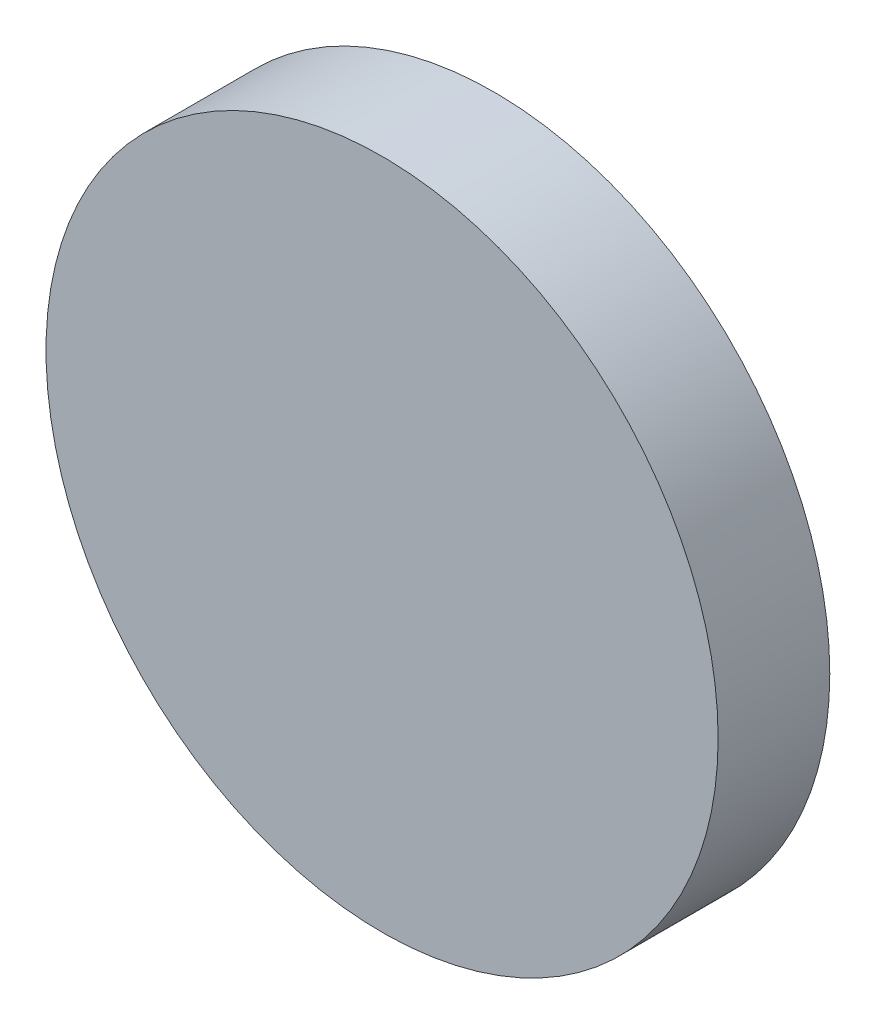
ISO-10303-21;
HEADER;
FILE_DESCRIPTION(('STEP AP214'),'2;1');
FILE_NAME('part.step','',(''),(''),'','','');
FILE_SCHEMA(('AUTOMOTIVE_DESIGN { 1 0 10303 214 1 1 1 1 }'));
ENDSEC;
DATA;
#1=APPLICATION_CONTEXT('core data for automotive mechanical design processes');
#2=APPLICATION_PROTOCOL_DEFINITION('international standard','automotive_design',2000,#1);
#3=PRODUCT_CONTEXT('',#1,'mechanical');
#4=PRODUCT('Part','Part','',(#3));
#5=PRODUCT_RELATED_PRODUCT_CATEGORY('part','',(#4));
#6=PRODUCT_DEFINITION_FORMATION('','',#4);
#7=PRODUCT_DEFINITION_CONTEXT('part definition',#1,'design');
#8=PRODUCT_DEFINITION('design','',#6,#7);
#9=PRODUCT_DEFINITION_SHAPE('','',#8);
#10=(LENGTH_UNIT() NAMED_UNIT(*) SI_UNIT(.MILLI.,.METRE.));
#11=(NAMED_UNIT(*) PLANE_ANGLE_UNIT() SI_UNIT($,.RADIAN.));
#12=(NAMED_UNIT(*) SI_UNIT($,.STERADIAN.) SOLID_ANGLE_UNIT());
#13=UNCERTAINTY_MEASURE_WITH_UNIT(LENGTH_MEASURE(1.E-05),#10,'distance_accuracy_value','');
#14=(GEOMETRIC_REPRESENTATION_CONTEXT(3) GLOBAL_UNCERTAINTY_ASSIGNED_CONTEXT((#13)) GLOBAL_UNIT_ASSIGNED_CONTEXT((#10,
#11,#12)) REPRESENTATION_CONTEXT('',''));
#15=CARTESIAN_POINT('',(0.,0.,0.));
#16=DIRECTION('',(0.,0.,1.));
#17=DIRECTION('',(1.,0.,0.));
#18=AXIS2_PLACEMENT_3D('',#15,#16,#17);
#19=CARTESIAN_POINT('',(0.,0.,10.));
#20=DIRECTION('',(0.,0.,-1.));
#21=DIRECTION('',(-1.,0.,0.));
#22=AXIS2_PLACEMENT_3D('',#19,#20,#21);
#23=CYLINDRICAL_SURFACE('',#22,30.1);
#24=CARTESIAN_POINT('',(0.,0.,10.));
#25=DIRECTION('',(0.,0.,1.));
#26=DIRECTION('',(1.,0.,0.));
#27=AXIS2_PLACEMENT_3D('',#24,#25,#26);
#28=CIRCLE('',#27,30.1);
#29=CARTESIAN_POINT('',(30.1,0.,10.));
#30=VERTEX_POINT('',#29);
#31=EDGE_CURVE('E10',#30,#30,#28,.T.);
#32=ORIENTED_EDGE('',*,*,#31,.F.);
#33=EDGE_LOOP('',(#32));
#34=FACE_BOUND('',#33,.T.);
#35=CARTESIAN_POINT('',(0.,0.,0.));
#36=DIRECTION('',(0.,0.,1.));
#37=DIRECTION('',(1.,0.,0.));
#38=AXIS2_PLACEMENT_3D('',#35,#36,#37);
#39=CIRCLE('',#38,30.1);
#40=CARTESIAN_POINT('',(30.1,0.,0.));
#41=VERTEX_POINT('',#40);
#42=EDGE_CURVE('E38',#41,#41,#39,.T.);
#43=ORIENTED_EDGE('',*,*,#42,.T.);
#44=EDGE_LOOP('',(#43));
#45=FACE_BOUND('',#44,.T.);
#46=ADVANCED_FACE('F35',(#34,#45),#23,.T.);
#47=CARTESIAN_POINT('',(0.,0.,10.));
#48=DIRECTION('',(0.,0.,1.));
#49=DIRECTION('',(1.,0.,0.));
#50=AXIS2_PLACEMENT_3D('',#47,#48,#49);
#51=PLANE('',#50);
#52=ORIENTED_EDGE('',*,*,#31,.T.);
#53=EDGE_LOOP('',(#52));
#54=FACE_BOUND('',#53,.T.);
#55=ADVANCED_FACE('F84',(#54),#51,.T.);
#56=CARTESIAN_POINT('',(0.,0.,0.));
#57=DIRECTION('',(0.,0.,1.));
#58=DIRECTION('',(1.,0.,0.));
#59=AXIS2_PLACEMENT_3D('',#56,#57,#58);
#60=PLANE('',#59);
#61=CARTESIAN_POINT('',(9.01360189427675,-8.66054160497428,0.));
#62=DIRECTION('',(0.,0.,1.));
#63=DIRECTION('',(1.,0.,0.));
#64=AXIS2_PLACEMENT_3D('',#61,#62,#63);
#65=CIRCLE('',#64,2.5);
#66=CARTESIAN_POINT('',(11.5136018942768,-8.66054160497428,0.));
#67=VERTEX_POINT('',#66);
#68=EDGE_CURVE('E56',#67,#67,#65,.T.);
#69=ORIENTED_EDGE('',*,*,#68,.T.);
#70=EDGE_LOOP('',(#69));
#71=FACE_BOUND('',#70,.T.);
#72=CARTESIAN_POINT('',(-9.01360189427675,-8.66054160497428,0.));
#73=DIRECTION('',(0.,0.,1.));
#74=DIRECTION('',(1.,0.,0.));
#75=AXIS2_PLACEMENT_3D('',#72,#73,#74);
#76=CIRCLE('',#75,2.5);
#77=CARTESIAN_POINT('',(-6.51360189427675,-8.66054160497428,0.));
#78=VERTEX_POINT('',#77);
#79=EDGE_CURVE('E50',#78,#78,#76,.T.);
#80=ORIENTED_EDGE('',*,*,#79,.T.);
#81=EDGE_LOOP('',(#80));
#82=FACE_BOUND('',#81,.T.);
#83=CARTESIAN_POINT('',(0.,12.5,0.));
#84=DIRECTION('',(0.,0.,1.));
#85=DIRECTION('',(1.,0.,0.));
#86=AXIS2_PLACEMENT_3D('',#83,#84,#85);
#87=CIRCLE('',#86,2.5);
#88=CARTESIAN_POINT('',(2.5,12.5,0.));
#89=VERTEX_POINT('',#88);
#90=EDGE_CURVE('E47',#89,#89,#87,.T.);
#91=ORIENTED_EDGE('',*,*,#90,.T.);
#92=EDGE_LOOP('',(#91));
#93=FACE_BOUND('',#92,.T.);
#94=ORIENTED_EDGE('',*,*,#42,.F.);
#95=EDGE_LOOP('',(#94));
#96=FACE_BOUND('',#95,.T.);
#97=ADVANCED_FACE('F65',(#71,#82,#93,#96),#60,.F.);
#98=CARTESIAN_POINT('',(0.,12.5,-10.));
#99=DIRECTION('',(0.,0.,1.));
#100=DIRECTION('',(1.,0.,0.));
#101=AXIS2_PLACEMENT_3D('',#98,#99,#100);
#102=CYLINDRICAL_SURFACE('',#101,2.5);
#103=CARTESIAN_POINT('',(0.,12.5,-10.));
#104=DIRECTION('',(0.,0.,1.));
#105=DIRECTION('',(1.,0.,0.));
#106=AXIS2_PLACEMENT_3D('',#103,#104,#105);
#107=CIRCLE('',#106,2.5);
#108=CARTESIAN_POINT('',(2.5,12.5,-10.));
#109=VERTEX_POINT('',#108);
#110=EDGE_CURVE('E45',#109,#109,#107,.T.);
#111=ORIENTED_EDGE('',*,*,#110,.T.);
#112=EDGE_LOOP('',(#111));
#113=FACE_BOUND('',#112,.T.);
#114=ORIENTED_EDGE('',*,*,#90,.F.);
#115=EDGE_LOOP('',(#114));
#116=FACE_BOUND('',#115,.T.);
#117=ADVANCED_FACE('F94',(#113,#116),#102,.T.);
#118=CARTESIAN_POINT('',(0.,12.5,-10.));
#119=DIRECTION('',(0.,0.,1.));
#120=DIRECTION('',(1.,0.,0.));
#121=AXIS2_PLACEMENT_3D('',#118,#119,#120);
#122=PLANE('',#121);
#123=ORIENTED_EDGE('',*,*,#110,.F.);
#124=EDGE_LOOP('',(#123));
#125=FACE_BOUND('',#124,.T.);
#126=ADVANCED_FACE('F98',(#125),#122,.F.);
#127=CARTESIAN_POINT('',(-9.01360189427675,-8.66054160497428,-10.));
#128=DIRECTION('',(0.,0.,1.));
#129=DIRECTION('',(1.,0.,0.));
#130=AXIS2_PLACEMENT_3D('',#127,#128,#129);
#131=CYLINDRICAL_SURFACE('',#130,2.5);
#132=CARTESIAN_POINT('',(-9.01360189427675,-8.66054160497428,-10.));
#133=DIRECTION('',(0.,0.,1.));
#134=DIRECTION('',(1.,0.,0.));
#135=AXIS2_PLACEMENT_3D('',#132,#133,#134);
#136=CIRCLE('',#135,2.5);
#137=CARTESIAN_POINT('',(-6.51360189427675,-8.66054160497428,-10.));
#138=VERTEX_POINT('',#137);
#139=EDGE_CURVE('E53',#138,#138,#136,.T.);
#140=ORIENTED_EDGE('',*,*,#139,.T.);
#141=EDGE_LOOP('',(#140));
#142=FACE_BOUND('',#141,.T.);
#143=ORIENTED_EDGE('',*,*,#79,.F.);
#144=EDGE_LOOP('',(#143));
#145=FACE_BOUND('',#144,.T.);
#146=ADVANCED_FACE('F80',(#142,#145),#131,.T.);
#147=CARTESIAN_POINT('',(-9.01360189427675,-8.66054160497428,-10.));
#148=DIRECTION('',(0.,0.,1.));
#149=DIRECTION('',(1.,0.,0.));
#150=AXIS2_PLACEMENT_3D('',#147,#148,#149);
#151=PLANE('',#150);
#152=ORIENTED_EDGE('',*,*,#139,.F.);
#153=EDGE_LOOP('',(#152));
#154=FACE_BOUND('',#153,.T.);
#155=ADVANCED_FACE('F71',(#154),#151,.F.);
#156=CARTESIAN_POINT('',(9.01360189427675,-8.66054160497428,-10.));
#157=DIRECTION('',(0.,0.,1.));
#158=DIRECTION('',(1.,0.,0.));
#159=AXIS2_PLACEMENT_3D('',#156,#157,#158);
#160=CYLINDRICAL_SURFACE('',#159,2.5);
#161=CARTESIAN_POINT('',(9.01360189427675,-8.66054160497428,-10.));
#162=DIRECTION('',(0.,0.,1.));
#163=DIRECTION('',(1.,0.,0.));
#164=AXIS2_PLACEMENT_3D('',#161,#162,#163);
#165=CIRCLE('',#164,2.5);
#166=CARTESIAN_POINT('',(11.5136018942768,-8.66054160497428,-10.));
#167=VERTEX_POINT('',#166);
#168=EDGE_CURVE('E59',#167,#167,#165,.T.);
#169=ORIENTED_EDGE('',*,*,#168,.T.);
#170=EDGE_LOOP('',(#169));
#171=FACE_BOUND('',#170,.T.);
#172=ORIENTED_EDGE('',*,*,#68,.F.);
#173=EDGE_LOOP('',(#172));
#174=FACE_BOUND('',#173,.T.);
#175=ADVANCED_FACE('F68',(#171,#174),#160,.T.);
#176=CARTESIAN_POINT('',(9.01360189427675,-8.66054160497428,-10.));
#177=DIRECTION('',(0.,0.,1.));
#178=DIRECTION('',(1.,0.,0.));
#179=AXIS2_PLACEMENT_3D('',#176,#177,#178);
#180=PLANE('',#179);
#181=ORIENTED_EDGE('',*,*,#168,.F.);
#182=EDGE_LOOP('',(#181));
#183=FACE_BOUND('',#182,.T.);
#184=ADVANCED_FACE('F70',(#183),#180,.F.);
#185=CLOSED_SHELL('',(#46,#55,#97,#117,#126,#146,#155,#175,#184));
#186=MANIFOLD_SOLID_BREP('B2',#185);
#187=ADVANCED_BREP_SHAPE_REPRESENTATION('',(#18,#186),#14);
#188=SHAPE_DEFINITION_REPRESENTATION(#9,#187);
ENDSEC;
END-ISO-10303-21;
